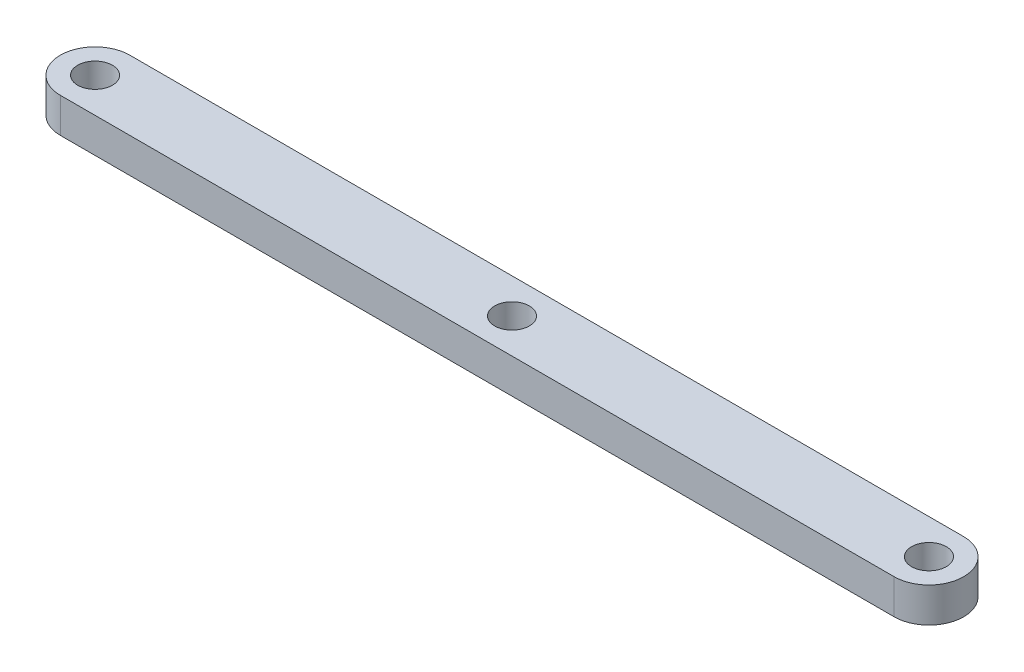
ISO-10303-21;
HEADER;
FILE_DESCRIPTION(('STEP AP214'),'2;1');
FILE_NAME('part.step','',(''),(''),'','','');
FILE_SCHEMA(('AUTOMOTIVE_DESIGN { 1 0 10303 214 1 1 1 1 }'));
ENDSEC;
DATA;
#1=APPLICATION_CONTEXT('core data for automotive mechanical design processes');
#2=APPLICATION_PROTOCOL_DEFINITION('international standard','automotive_design',2000,#1);
#3=PRODUCT_CONTEXT('',#1,'mechanical');
#4=PRODUCT('Part','Part','',(#3));
#5=PRODUCT_RELATED_PRODUCT_CATEGORY('part','',(#4));
#6=PRODUCT_DEFINITION_FORMATION('','',#4);
#7=PRODUCT_DEFINITION_CONTEXT('part definition',#1,'design');
#8=PRODUCT_DEFINITION('design','',#6,#7);
#9=PRODUCT_DEFINITION_SHAPE('','',#8);
#10=(LENGTH_UNIT() NAMED_UNIT(*) SI_UNIT(.MILLI.,.METRE.));
#11=(NAMED_UNIT(*) PLANE_ANGLE_UNIT() SI_UNIT($,.RADIAN.));
#12=(NAMED_UNIT(*) SI_UNIT($,.STERADIAN.) SOLID_ANGLE_UNIT());
#13=UNCERTAINTY_MEASURE_WITH_UNIT(LENGTH_MEASURE(1.E-05),#10,'distance_accuracy_value','');
#14=(GEOMETRIC_REPRESENTATION_CONTEXT(3) GLOBAL_UNCERTAINTY_ASSIGNED_CONTEXT((#13)) GLOBAL_UNIT_ASSIGNED_CONTEXT((#10,
#11,#12)) REPRESENTATION_CONTEXT('',''));
#15=CARTESIAN_POINT('',(0.,0.,0.));
#16=DIRECTION('',(0.,0.,1.));
#17=DIRECTION('',(1.,0.,0.));
#18=AXIS2_PLACEMENT_3D('',#15,#16,#17);
#19=CARTESIAN_POINT('',(0.,6.35,0.));
#20=DIRECTION('',(0.,-1.,0.));
#21=DIRECTION('',(0.,0.,-1.));
#22=AXIS2_PLACEMENT_3D('',#19,#20,#21);
#23=CYLINDRICAL_SURFACE('',#22,6.35);
#24=CARTESIAN_POINT('',(0.,0.,0.));
#25=DIRECTION('',(0.,1.,0.));
#26=DIRECTION('',(0.,0.,1.));
#27=AXIS2_PLACEMENT_3D('',#24,#25,#26);
#28=CIRCLE('',#27,6.35);
#29=CARTESIAN_POINT('',(0.,0.,6.35));
#30=VERTEX_POINT('',#29);
#31=CARTESIAN_POINT('',(0.,0.,-6.35));
#32=VERTEX_POINT('',#31);
#33=EDGE_CURVE('E111',#30,#32,#28,.T.);
#34=ORIENTED_EDGE('',*,*,#33,.T.);
#35=DIRECTION('',(0.,-1.,0.));
#36=VECTOR('',#35,1.);
#37=CARTESIAN_POINT('',(0.,6.35,-6.35));
#38=LINE('',#37,#36);
#39=CARTESIAN_POINT('',(0.,6.35,-6.35));
#40=VERTEX_POINT('',#39);
#41=EDGE_CURVE('E11',#40,#32,#38,.T.);
#42=ORIENTED_EDGE('',*,*,#41,.F.);
#43=CARTESIAN_POINT('',(0.,6.35,0.));
#44=DIRECTION('',(0.,1.,0.));
#45=DIRECTION('',(0.,0.,1.));
#46=AXIS2_PLACEMENT_3D('',#43,#44,#45);
#47=CIRCLE('',#46,6.35);
#48=CARTESIAN_POINT('',(0.,6.35,6.35));
#49=VERTEX_POINT('',#48);
#50=EDGE_CURVE('E95',#49,#40,#47,.T.);
#51=ORIENTED_EDGE('',*,*,#50,.F.);
#52=DIRECTION('',(0.,-1.,0.));
#53=VECTOR('',#52,1.);
#54=CARTESIAN_POINT('',(0.,6.35,6.35));
#55=LINE('',#54,#53);
#56=EDGE_CURVE('E107',#49,#30,#55,.T.);
#57=ORIENTED_EDGE('',*,*,#56,.T.);
#58=EDGE_LOOP('',(#34,#42,#51,#57));
#59=FACE_BOUND('',#58,.T.);
#60=ADVANCED_FACE('F43',(#59),#23,.T.);
#61=CARTESIAN_POINT('',(0.,6.35,-6.35));
#62=DIRECTION('',(0.,0.,1.));
#63=DIRECTION('',(1.,0.,0.));
#64=AXIS2_PLACEMENT_3D('',#61,#62,#63);
#65=PLANE('',#64);
#66=DIRECTION('',(-1.,0.,0.));
#67=VECTOR('',#66,1.);
#68=CARTESIAN_POINT('',(0.,0.,-6.35));
#69=LINE('',#68,#67);
#70=CARTESIAN_POINT('',(-152.4,0.,-6.34999999999998));
#71=VERTEX_POINT('',#70);
#72=EDGE_CURVE('E100',#32,#71,#69,.T.);
#73=ORIENTED_EDGE('',*,*,#72,.T.);
#74=DIRECTION('',(0.,-1.,0.));
#75=VECTOR('',#74,1.);
#76=CARTESIAN_POINT('',(-152.4,6.35,-6.34999999999998));
#77=LINE('',#76,#75);
#78=CARTESIAN_POINT('',(-152.4,6.35,-6.34999999999998));
#79=VERTEX_POINT('',#78);
#80=EDGE_CURVE('E52',#79,#71,#77,.T.);
#81=ORIENTED_EDGE('',*,*,#80,.F.);
#82=DIRECTION('',(-1.,0.,0.));
#83=VECTOR('',#82,1.);
#84=CARTESIAN_POINT('',(0.,6.35,-6.35));
#85=LINE('',#84,#83);
#86=EDGE_CURVE('E90',#40,#79,#85,.T.);
#87=ORIENTED_EDGE('',*,*,#86,.F.);
#88=ORIENTED_EDGE('',*,*,#41,.T.);
#89=EDGE_LOOP('',(#73,#81,#87,#88));
#90=FACE_BOUND('',#89,.T.);
#91=ADVANCED_FACE('F99',(#90),#65,.F.);
#92=CARTESIAN_POINT('',(-152.4,6.35,0.));
#93=DIRECTION('',(0.,-1.,0.));
#94=DIRECTION('',(0.,0.,-1.));
#95=AXIS2_PLACEMENT_3D('',#92,#93,#94);
#96=CYLINDRICAL_SURFACE('',#95,6.35);
#97=CARTESIAN_POINT('',(-152.4,0.,0.));
#98=DIRECTION('',(0.,1.,0.));
#99=DIRECTION('',(0.,0.,1.));
#100=AXIS2_PLACEMENT_3D('',#97,#98,#99);
#101=CIRCLE('',#100,6.35);
#102=CARTESIAN_POINT('',(-152.4,0.,6.35000000000002));
#103=VERTEX_POINT('',#102);
#104=EDGE_CURVE('E77',#71,#103,#101,.T.);
#105=ORIENTED_EDGE('',*,*,#104,.T.);
#106=DIRECTION('',(0.,-1.,0.));
#107=VECTOR('',#106,1.);
#108=CARTESIAN_POINT('',(-152.4,6.35,6.35000000000002));
#109=LINE('',#108,#107);
#110=CARTESIAN_POINT('',(-152.4,6.35,6.35000000000002));
#111=VERTEX_POINT('',#110);
#112=EDGE_CURVE('E102',#111,#103,#109,.T.);
#113=ORIENTED_EDGE('',*,*,#112,.F.);
#114=CARTESIAN_POINT('',(-152.4,6.35,0.));
#115=DIRECTION('',(0.,1.,0.));
#116=DIRECTION('',(0.,0.,1.));
#117=AXIS2_PLACEMENT_3D('',#114,#115,#116);
#118=CIRCLE('',#117,6.35);
#119=EDGE_CURVE('E93',#79,#111,#118,.T.);
#120=ORIENTED_EDGE('',*,*,#119,.F.);
#121=ORIENTED_EDGE('',*,*,#80,.T.);
#122=EDGE_LOOP('',(#105,#113,#120,#121));
#123=FACE_BOUND('',#122,.T.);
#124=ADVANCED_FACE('F103',(#123),#96,.T.);
#125=CARTESIAN_POINT('',(0.,6.35,6.35));
#126=DIRECTION('',(0.,0.,-1.));
#127=DIRECTION('',(-1.,0.,0.));
#128=AXIS2_PLACEMENT_3D('',#125,#126,#127);
#129=PLANE('',#128);
#130=DIRECTION('',(1.,0.,0.));
#131=VECTOR('',#130,1.);
#132=CARTESIAN_POINT('',(0.,0.,6.35));
#133=LINE('',#132,#131);
#134=EDGE_CURVE('E83',#103,#30,#133,.T.);
#135=ORIENTED_EDGE('',*,*,#134,.T.);
#136=ORIENTED_EDGE('',*,*,#56,.F.);
#137=DIRECTION('',(1.,0.,0.));
#138=VECTOR('',#137,1.);
#139=CARTESIAN_POINT('',(0.,6.35,6.35));
#140=LINE('',#139,#138);
#141=EDGE_CURVE('E60',#111,#49,#140,.T.);
#142=ORIENTED_EDGE('',*,*,#141,.F.);
#143=ORIENTED_EDGE('',*,*,#112,.T.);
#144=EDGE_LOOP('',(#135,#136,#142,#143));
#145=FACE_BOUND('',#144,.T.);
#146=ADVANCED_FACE('F125',(#145),#129,.F.);
#147=CARTESIAN_POINT('',(0.,6.35,0.));
#148=DIRECTION('',(0.,1.,0.));
#149=DIRECTION('',(0.,0.,1.));
#150=AXIS2_PLACEMENT_3D('',#147,#148,#149);
#151=PLANE('',#150);
#152=CARTESIAN_POINT('',(-152.4,6.35,0.));
#153=DIRECTION('',(0.,1.,0.));
#154=DIRECTION('',(0.,0.,1.));
#155=AXIS2_PLACEMENT_3D('',#152,#153,#154);
#156=CIRCLE('',#155,3.175);
#157=CARTESIAN_POINT('',(-152.4,6.35,3.17500000000002));
#158=VERTEX_POINT('',#157);
#159=EDGE_CURVE('E148',#158,#158,#156,.T.);
#160=ORIENTED_EDGE('',*,*,#159,.F.);
#161=EDGE_LOOP('',(#160));
#162=FACE_BOUND('',#161,.T.);
#163=CARTESIAN_POINT('',(0.,6.35,0.));
#164=DIRECTION('',(0.,1.,0.));
#165=DIRECTION('',(0.,0.,1.));
#166=AXIS2_PLACEMENT_3D('',#163,#164,#165);
#167=CIRCLE('',#166,3.175);
#168=CARTESIAN_POINT('',(0.,6.35,3.175));
#169=VERTEX_POINT('',#168);
#170=EDGE_CURVE('E144',#169,#169,#167,.T.);
#171=ORIENTED_EDGE('',*,*,#170,.F.);
#172=EDGE_LOOP('',(#171));
#173=FACE_BOUND('',#172,.T.);
#174=CARTESIAN_POINT('',(-76.2,6.35,0.));
#175=DIRECTION('',(0.,1.,0.));
#176=DIRECTION('',(0.,0.,1.));
#177=AXIS2_PLACEMENT_3D('',#174,#175,#176);
#178=CIRCLE('',#177,3.175);
#179=CARTESIAN_POINT('',(-76.2,6.35,3.175));
#180=VERTEX_POINT('',#179);
#181=EDGE_CURVE('E136',#180,#180,#178,.T.);
#182=ORIENTED_EDGE('',*,*,#181,.F.);
#183=EDGE_LOOP('',(#182));
#184=FACE_BOUND('',#183,.T.);
#185=ORIENTED_EDGE('',*,*,#50,.T.);
#186=ORIENTED_EDGE('',*,*,#86,.T.);
#187=ORIENTED_EDGE('',*,*,#119,.T.);
#188=ORIENTED_EDGE('',*,*,#141,.T.);
#189=EDGE_LOOP('',(#185,#186,#187,#188));
#190=FACE_BOUND('',#189,.T.);
#191=ADVANCED_FACE('F91',(#162,#173,#184,#190),#151,.T.);
#192=CARTESIAN_POINT('',(0.,0.,0.));
#193=DIRECTION('',(0.,1.,0.));
#194=DIRECTION('',(0.,0.,1.));
#195=AXIS2_PLACEMENT_3D('',#192,#193,#194);
#196=PLANE('',#195);
#197=CARTESIAN_POINT('',(-152.4,0.,0.));
#198=DIRECTION('',(0.,1.,0.));
#199=DIRECTION('',(0.,0.,1.));
#200=AXIS2_PLACEMENT_3D('',#197,#198,#199);
#201=CIRCLE('',#200,3.175);
#202=CARTESIAN_POINT('',(-152.4,0.,3.17500000000002));
#203=VERTEX_POINT('',#202);
#204=EDGE_CURVE('E115',#203,#203,#201,.T.);
#205=ORIENTED_EDGE('',*,*,#204,.T.);
#206=EDGE_LOOP('',(#205));
#207=FACE_BOUND('',#206,.T.);
#208=CARTESIAN_POINT('',(0.,0.,0.));
#209=DIRECTION('',(0.,1.,0.));
#210=DIRECTION('',(0.,0.,1.));
#211=AXIS2_PLACEMENT_3D('',#208,#209,#210);
#212=CIRCLE('',#211,3.175);
#213=CARTESIAN_POINT('',(0.,0.,3.175));
#214=VERTEX_POINT('',#213);
#215=EDGE_CURVE('E140',#214,#214,#212,.T.);
#216=ORIENTED_EDGE('',*,*,#215,.T.);
#217=EDGE_LOOP('',(#216));
#218=FACE_BOUND('',#217,.T.);
#219=CARTESIAN_POINT('',(-76.2,0.,0.));
#220=DIRECTION('',(0.,1.,0.));
#221=DIRECTION('',(0.,0.,1.));
#222=AXIS2_PLACEMENT_3D('',#219,#220,#221);
#223=CIRCLE('',#222,3.175);
#224=CARTESIAN_POINT('',(-76.2,0.,3.175));
#225=VERTEX_POINT('',#224);
#226=EDGE_CURVE('E132',#225,#225,#223,.T.);
#227=ORIENTED_EDGE('',*,*,#226,.T.);
#228=EDGE_LOOP('',(#227));
#229=FACE_BOUND('',#228,.T.);
#230=ORIENTED_EDGE('',*,*,#33,.F.);
#231=ORIENTED_EDGE('',*,*,#134,.F.);
#232=ORIENTED_EDGE('',*,*,#104,.F.);
#233=ORIENTED_EDGE('',*,*,#72,.F.);
#234=EDGE_LOOP('',(#230,#231,#232,#233));
#235=FACE_BOUND('',#234,.T.);
#236=ADVANCED_FACE('F128',(#207,#218,#229,#235),#196,.F.);
#237=CARTESIAN_POINT('',(-76.2,0.,0.));
#238=DIRECTION('',(0.,1.,0.));
#239=DIRECTION('',(0.,0.,1.));
#240=AXIS2_PLACEMENT_3D('',#237,#238,#239);
#241=CYLINDRICAL_SURFACE('',#240,3.175);
#242=ORIENTED_EDGE('',*,*,#226,.F.);
#243=EDGE_LOOP('',(#242));
#244=FACE_BOUND('',#243,.T.);
#245=ORIENTED_EDGE('',*,*,#181,.T.);
#246=EDGE_LOOP('',(#245));
#247=FACE_BOUND('',#246,.T.);
#248=ADVANCED_FACE('F172',(#244,#247),#241,.F.);
#249=CARTESIAN_POINT('',(0.,0.,0.));
#250=DIRECTION('',(0.,1.,0.));
#251=DIRECTION('',(0.,0.,1.));
#252=AXIS2_PLACEMENT_3D('',#249,#250,#251);
#253=CYLINDRICAL_SURFACE('',#252,3.175);
#254=ORIENTED_EDGE('',*,*,#215,.F.);
#255=EDGE_LOOP('',(#254));
#256=FACE_BOUND('',#255,.T.);
#257=ORIENTED_EDGE('',*,*,#170,.T.);
#258=EDGE_LOOP('',(#257));
#259=FACE_BOUND('',#258,.T.);
#260=ADVANCED_FACE('F161',(#256,#259),#253,.F.);
#261=CARTESIAN_POINT('',(-152.4,0.,0.));
#262=DIRECTION('',(0.,1.,0.));
#263=DIRECTION('',(0.,0.,1.));
#264=AXIS2_PLACEMENT_3D('',#261,#262,#263);
#265=CYLINDRICAL_SURFACE('',#264,3.175);
#266=ORIENTED_EDGE('',*,*,#204,.F.);
#267=EDGE_LOOP('',(#266));
#268=FACE_BOUND('',#267,.T.);
#269=ORIENTED_EDGE('',*,*,#159,.T.);
#270=EDGE_LOOP('',(#269));
#271=FACE_BOUND('',#270,.T.);
#272=ADVANCED_FACE('F158',(#268,#271),#265,.F.);
#273=CLOSED_SHELL('',(#60,#91,#124,#146,#191,#236,#248,#260,#272));
#274=MANIFOLD_SOLID_BREP('B2',#273);
#275=ADVANCED_BREP_SHAPE_REPRESENTATION('',(#18,#274),#14);
#276=SHAPE_DEFINITION_REPRESENTATION(#9,#275);
ENDSEC;
END-ISO-10303-21;
